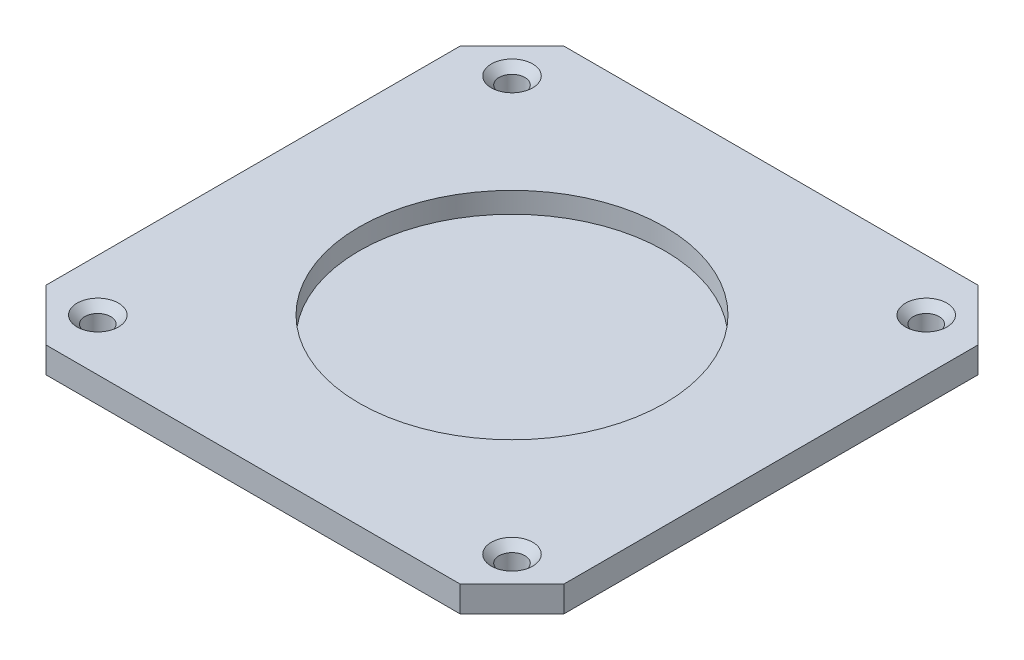
ISO-10303-21;
HEADER;
FILE_DESCRIPTION(('STEP AP214'),'2;1');
FILE_NAME('part.step','',(''),(''),'','','');
FILE_SCHEMA(('AUTOMOTIVE_DESIGN { 1 0 10303 214 1 1 1 1 }'));
ENDSEC;
DATA;
#1=APPLICATION_CONTEXT('core data for automotive mechanical design processes');
#2=APPLICATION_PROTOCOL_DEFINITION('international standard','automotive_design',2000,#1);
#3=PRODUCT_CONTEXT('',#1,'mechanical');
#4=PRODUCT('Part','Part','',(#3));
#5=PRODUCT_RELATED_PRODUCT_CATEGORY('part','',(#4));
#6=PRODUCT_DEFINITION_FORMATION('','',#4);
#7=PRODUCT_DEFINITION_CONTEXT('part definition',#1,'design');
#8=PRODUCT_DEFINITION('design','',#6,#7);
#9=PRODUCT_DEFINITION_SHAPE('','',#8);
#10=(LENGTH_UNIT() NAMED_UNIT(*) SI_UNIT(.MILLI.,.METRE.));
#11=(NAMED_UNIT(*) PLANE_ANGLE_UNIT() SI_UNIT($,.RADIAN.));
#12=(NAMED_UNIT(*) SI_UNIT($,.STERADIAN.) SOLID_ANGLE_UNIT());
#13=UNCERTAINTY_MEASURE_WITH_UNIT(LENGTH_MEASURE(1.E-05),#10,'distance_accuracy_value','');
#14=(GEOMETRIC_REPRESENTATION_CONTEXT(3) GLOBAL_UNCERTAINTY_ASSIGNED_CONTEXT((#13)) GLOBAL_UNIT_ASSIGNED_CONTEXT((#10,
#11,#12)) REPRESENTATION_CONTEXT('',''));
#15=CARTESIAN_POINT('',(0.,0.,0.));
#16=DIRECTION('',(0.,0.,1.));
#17=DIRECTION('',(1.,0.,0.));
#18=AXIS2_PLACEMENT_3D('',#15,#16,#17);
#19=CARTESIAN_POINT('',(0.,-2.5,0.));
#20=DIRECTION('',(0.,-1.,0.));
#21=DIRECTION('',(0.,0.,-1.));
#22=AXIS2_PLACEMENT_3D('',#19,#20,#21);
#23=PLANE('',#22);
#24=CARTESIAN_POINT('',(-40.0000000000004,-2.5,39.9999999999996));
#25=DIRECTION('',(0.,1.,0.));
#26=DIRECTION('',(0.,0.,1.));
#27=AXIS2_PLACEMENT_3D('',#24,#25,#26);
#28=CIRCLE('',#27,2.5);
#29=CARTESIAN_POINT('',(-40.0000000000004,-2.5,42.4999999999996));
#30=VERTEX_POINT('',#29);
#31=EDGE_CURVE('E203',#30,#30,#28,.T.);
#32=ORIENTED_EDGE('',*,*,#31,.T.);
#33=EDGE_LOOP('',(#32));
#34=FACE_BOUND('',#33,.T.);
#35=CARTESIAN_POINT('',(40.,-2.5,40.));
#36=DIRECTION('',(0.,1.,0.));
#37=DIRECTION('',(0.,0.,1.));
#38=AXIS2_PLACEMENT_3D('',#35,#36,#37);
#39=CIRCLE('',#38,2.5);
#40=CARTESIAN_POINT('',(40.,-2.5,42.5));
#41=VERTEX_POINT('',#40);
#42=EDGE_CURVE('E194',#41,#41,#39,.T.);
#43=ORIENTED_EDGE('',*,*,#42,.T.);
#44=EDGE_LOOP('',(#43));
#45=FACE_BOUND('',#44,.T.);
#46=DIRECTION('',(1.,0.,0.));
#47=VECTOR('',#46,1.);
#48=CARTESIAN_POINT('',(-50.,-2.5,50.));
#49=LINE('',#48,#47);
#50=CARTESIAN_POINT('',(-40.,-2.5,50.));
#51=VERTEX_POINT('',#50);
#52=CARTESIAN_POINT('',(40.,-2.5,50.));
#53=VERTEX_POINT('',#52);
#54=EDGE_CURVE('E116',#51,#53,#49,.T.);
#55=ORIENTED_EDGE('',*,*,#54,.F.);
#56=DIRECTION('',(0.707106781186546,0.,0.707106781186549));
#57=VECTOR('',#56,1.);
#58=CARTESIAN_POINT('',(-45.0000000000001,-2.5,44.9999999999999));
#59=LINE('',#58,#57);
#60=CARTESIAN_POINT('',(-50.,-2.5,40.));
#61=VERTEX_POINT('',#60);
#62=EDGE_CURVE('E99',#51,#61,#59,.F.);
#63=ORIENTED_EDGE('',*,*,#62,.T.);
#64=DIRECTION('',(0.,0.,1.));
#65=VECTOR('',#64,1.);
#66=CARTESIAN_POINT('',(-50.,-2.5,50.));
#67=LINE('',#66,#65);
#68=CARTESIAN_POINT('',(-50.,-2.5,-40.));
#69=VERTEX_POINT('',#68);
#70=EDGE_CURVE('E126',#69,#61,#67,.T.);
#71=ORIENTED_EDGE('',*,*,#70,.F.);
#72=DIRECTION('',(-0.707106781186549,0.,0.707106781186546));
#73=VECTOR('',#72,1.);
#74=CARTESIAN_POINT('',(-44.9999999999999,-2.5,-45.0000000000001));
#75=LINE('',#74,#73);
#76=CARTESIAN_POINT('',(-40.,-2.5,-50.));
#77=VERTEX_POINT('',#76);
#78=EDGE_CURVE('E120',#69,#77,#75,.F.);
#79=ORIENTED_EDGE('',*,*,#78,.T.);
#80=DIRECTION('',(-1.,0.,0.));
#81=VECTOR('',#80,1.);
#82=CARTESIAN_POINT('',(-50.,-2.5,-50.));
#83=LINE('',#82,#81);
#84=CARTESIAN_POINT('',(40.,-2.5,-50.));
#85=VERTEX_POINT('',#84);
#86=EDGE_CURVE('E130',#85,#77,#83,.T.);
#87=ORIENTED_EDGE('',*,*,#86,.F.);
#88=DIRECTION('',(-0.707106781186546,0.,-0.707106781186549));
#89=VECTOR('',#88,1.);
#90=CARTESIAN_POINT('',(45.0000000000001,-2.5,-44.9999999999999));
#91=LINE('',#90,#89);
#92=CARTESIAN_POINT('',(50.,-2.5,-40.));
#93=VERTEX_POINT('',#92);
#94=EDGE_CURVE('E136',#85,#93,#91,.F.);
#95=ORIENTED_EDGE('',*,*,#94,.T.);
#96=DIRECTION('',(0.,0.,-1.));
#97=VECTOR('',#96,1.);
#98=CARTESIAN_POINT('',(50.,-2.5,50.));
#99=LINE('',#98,#97);
#100=CARTESIAN_POINT('',(50.,-2.5,40.));
#101=VERTEX_POINT('',#100);
#102=EDGE_CURVE('E158',#101,#93,#99,.T.);
#103=ORIENTED_EDGE('',*,*,#102,.F.);
#104=DIRECTION('',(0.707106781186549,0.,-0.707106781186546));
#105=VECTOR('',#104,1.);
#106=CARTESIAN_POINT('',(44.9999999999999,-2.5,45.0000000000001));
#107=LINE('',#106,#105);
#108=EDGE_CURVE('E110',#101,#53,#107,.F.);
#109=ORIENTED_EDGE('',*,*,#108,.T.);
#110=EDGE_LOOP('',(#55,#63,#71,#79,#87,#95,#103,#109));
#111=FACE_BOUND('',#110,.T.);
#112=CARTESIAN_POINT('',(-40.,-2.5,-40.));
#113=DIRECTION('',(0.,1.,0.));
#114=DIRECTION('',(0.,0.,1.));
#115=AXIS2_PLACEMENT_3D('',#112,#113,#114);
#116=CIRCLE('',#115,2.5);
#117=CARTESIAN_POINT('',(-40.,-2.5,-37.5));
#118=VERTEX_POINT('',#117);
#119=EDGE_CURVE('E163',#118,#118,#116,.T.);
#120=ORIENTED_EDGE('',*,*,#119,.T.);
#121=EDGE_LOOP('',(#120));
#122=FACE_BOUND('',#121,.T.);
#123=CARTESIAN_POINT('',(40.0000000000001,-2.5,-39.9999999999999));
#124=DIRECTION('',(0.,1.,0.));
#125=DIRECTION('',(0.,0.,1.));
#126=AXIS2_PLACEMENT_3D('',#123,#124,#125);
#127=CIRCLE('',#126,2.5);
#128=CARTESIAN_POINT('',(40.0000000000001,-2.5,-37.4999999999999));
#129=VERTEX_POINT('',#128);
#130=EDGE_CURVE('E185',#129,#129,#127,.T.);
#131=ORIENTED_EDGE('',*,*,#130,.T.);
#132=EDGE_LOOP('',(#131));
#133=FACE_BOUND('',#132,.T.);
#134=ADVANCED_FACE('F33',(#34,#45,#111,#122,#133),#23,.T.);
#135=CARTESIAN_POINT('',(50.,2.5,50.));
#136=DIRECTION('',(-1.,0.,0.));
#137=DIRECTION('',(0.,0.,1.));
#138=AXIS2_PLACEMENT_3D('',#135,#136,#137);
#139=PLANE('',#138);
#140=DIRECTION('',(0.,0.,-1.));
#141=VECTOR('',#140,1.);
#142=CARTESIAN_POINT('',(50.,2.5,50.));
#143=LINE('',#142,#141);
#144=CARTESIAN_POINT('',(50.,2.5,40.));
#145=VERTEX_POINT('',#144);
#146=CARTESIAN_POINT('',(50.,2.5,-40.));
#147=VERTEX_POINT('',#146);
#148=EDGE_CURVE('E125',#145,#147,#143,.T.);
#149=ORIENTED_EDGE('',*,*,#148,.F.);
#150=DIRECTION('',(0.,-1.,0.));
#151=VECTOR('',#150,1.);
#152=CARTESIAN_POINT('',(50.,2.5,40.));
#153=LINE('',#152,#151);
#154=EDGE_CURVE('E151',#145,#101,#153,.T.);
#155=ORIENTED_EDGE('',*,*,#154,.T.);
#156=ORIENTED_EDGE('',*,*,#102,.T.);
#157=DIRECTION('',(0.,1.,0.));
#158=VECTOR('',#157,1.);
#159=CARTESIAN_POINT('',(50.,2.5,-40.));
#160=LINE('',#159,#158);
#161=EDGE_CURVE('E149',#93,#147,#160,.T.);
#162=ORIENTED_EDGE('',*,*,#161,.T.);
#163=EDGE_LOOP('',(#149,#155,#156,#162));
#164=FACE_BOUND('',#163,.T.);
#165=ADVANCED_FACE('F157',(#164),#139,.F.);
#166=CARTESIAN_POINT('',(-50.,2.5,-50.));
#167=DIRECTION('',(0.,0.,1.));
#168=DIRECTION('',(1.,0.,0.));
#169=AXIS2_PLACEMENT_3D('',#166,#167,#168);
#170=PLANE('',#169);
#171=DIRECTION('',(-1.,0.,0.));
#172=VECTOR('',#171,1.);
#173=CARTESIAN_POINT('',(-50.,2.5,-50.));
#174=LINE('',#173,#172);
#175=CARTESIAN_POINT('',(40.,2.5,-50.));
#176=VERTEX_POINT('',#175);
#177=CARTESIAN_POINT('',(-40.,2.5,-50.));
#178=VERTEX_POINT('',#177);
#179=EDGE_CURVE('E128',#176,#178,#174,.T.);
#180=ORIENTED_EDGE('',*,*,#179,.F.);
#181=DIRECTION('',(0.,-1.,0.));
#182=VECTOR('',#181,1.);
#183=CARTESIAN_POINT('',(40.,2.5,-50.));
#184=LINE('',#183,#182);
#185=EDGE_CURVE('E11',#176,#85,#184,.T.);
#186=ORIENTED_EDGE('',*,*,#185,.T.);
#187=ORIENTED_EDGE('',*,*,#86,.T.);
#188=DIRECTION('',(0.,1.,0.));
#189=VECTOR('',#188,1.);
#190=CARTESIAN_POINT('',(-40.,2.5,-50.));
#191=LINE('',#190,#189);
#192=EDGE_CURVE('E41',#77,#178,#191,.T.);
#193=ORIENTED_EDGE('',*,*,#192,.T.);
#194=EDGE_LOOP('',(#180,#186,#187,#193));
#195=FACE_BOUND('',#194,.T.);
#196=ADVANCED_FACE('F233',(#195),#170,.F.);
#197=CARTESIAN_POINT('',(-50.,2.5,50.));
#198=DIRECTION('',(1.,0.,0.));
#199=DIRECTION('',(0.,0.,-1.));
#200=AXIS2_PLACEMENT_3D('',#197,#198,#199);
#201=PLANE('',#200);
#202=ORIENTED_EDGE('',*,*,#70,.T.);
#203=DIRECTION('',(0.,1.,0.));
#204=VECTOR('',#203,1.);
#205=CARTESIAN_POINT('',(-50.,2.5,40.));
#206=LINE('',#205,#204);
#207=CARTESIAN_POINT('',(-50.,2.5,40.));
#208=VERTEX_POINT('',#207);
#209=EDGE_CURVE('E104',#61,#208,#206,.T.);
#210=ORIENTED_EDGE('',*,*,#209,.T.);
#211=DIRECTION('',(0.,0.,1.));
#212=VECTOR('',#211,1.);
#213=CARTESIAN_POINT('',(-50.,2.5,50.));
#214=LINE('',#213,#212);
#215=CARTESIAN_POINT('',(-50.,2.5,-40.));
#216=VERTEX_POINT('',#215);
#217=EDGE_CURVE('E170',#216,#208,#214,.T.);
#218=ORIENTED_EDGE('',*,*,#217,.F.);
#219=DIRECTION('',(0.,-1.,0.));
#220=VECTOR('',#219,1.);
#221=CARTESIAN_POINT('',(-50.,2.5,-40.));
#222=LINE('',#221,#220);
#223=EDGE_CURVE('E109',#216,#69,#222,.T.);
#224=ORIENTED_EDGE('',*,*,#223,.T.);
#225=EDGE_LOOP('',(#202,#210,#218,#224));
#226=FACE_BOUND('',#225,.T.);
#227=ADVANCED_FACE('F231',(#226),#201,.F.);
#228=CARTESIAN_POINT('',(-50.,2.5,50.));
#229=DIRECTION('',(0.,0.,-1.));
#230=DIRECTION('',(-1.,0.,0.));
#231=AXIS2_PLACEMENT_3D('',#228,#229,#230);
#232=PLANE('',#231);
#233=DIRECTION('',(1.,0.,0.));
#234=VECTOR('',#233,1.);
#235=CARTESIAN_POINT('',(-50.,2.5,50.));
#236=LINE('',#235,#234);
#237=CARTESIAN_POINT('',(-40.,2.5,50.));
#238=VERTEX_POINT('',#237);
#239=CARTESIAN_POINT('',(40.,2.5,50.));
#240=VERTEX_POINT('',#239);
#241=EDGE_CURVE('E119',#238,#240,#236,.T.);
#242=ORIENTED_EDGE('',*,*,#241,.F.);
#243=DIRECTION('',(0.,-1.,0.));
#244=VECTOR('',#243,1.);
#245=CARTESIAN_POINT('',(-40.,2.5,50.));
#246=LINE('',#245,#244);
#247=EDGE_CURVE('E103',#238,#51,#246,.T.);
#248=ORIENTED_EDGE('',*,*,#247,.T.);
#249=ORIENTED_EDGE('',*,*,#54,.T.);
#250=DIRECTION('',(0.,1.,0.));
#251=VECTOR('',#250,1.);
#252=CARTESIAN_POINT('',(40.,2.5,50.));
#253=LINE('',#252,#251);
#254=EDGE_CURVE('E121',#53,#240,#253,.T.);
#255=ORIENTED_EDGE('',*,*,#254,.T.);
#256=EDGE_LOOP('',(#242,#248,#249,#255));
#257=FACE_BOUND('',#256,.T.);
#258=ADVANCED_FACE('F115',(#257),#232,.F.);
#259=CARTESIAN_POINT('',(0.,2.5,0.));
#260=DIRECTION('',(0.,-1.,0.));
#261=DIRECTION('',(0.,0.,-1.));
#262=AXIS2_PLACEMENT_3D('',#259,#260,#261);
#263=PLANE('',#262);
#264=CARTESIAN_POINT('',(-40.0000000000004,2.5,39.9999999999996));
#265=DIRECTION('',(0.,1.,0.));
#266=DIRECTION('',(0.,0.,1.));
#267=AXIS2_PLACEMENT_3D('',#264,#265,#266);
#268=CIRCLE('',#267,4.);
#269=CARTESIAN_POINT('',(-40.0000000000004,2.5,43.9999999999996));
#270=VERTEX_POINT('',#269);
#271=EDGE_CURVE('E209',#270,#270,#268,.T.);
#272=ORIENTED_EDGE('',*,*,#271,.F.);
#273=EDGE_LOOP('',(#272));
#274=FACE_BOUND('',#273,.T.);
#275=CARTESIAN_POINT('',(40.,2.5,40.));
#276=DIRECTION('',(0.,1.,0.));
#277=DIRECTION('',(0.,0.,1.));
#278=AXIS2_PLACEMENT_3D('',#275,#276,#277);
#279=CIRCLE('',#278,4.);
#280=CARTESIAN_POINT('',(40.,2.5,44.));
#281=VERTEX_POINT('',#280);
#282=EDGE_CURVE('E200',#281,#281,#279,.T.);
#283=ORIENTED_EDGE('',*,*,#282,.F.);
#284=EDGE_LOOP('',(#283));
#285=FACE_BOUND('',#284,.T.);
#286=CARTESIAN_POINT('',(40.0000000000001,2.5,-39.9999999999999));
#287=DIRECTION('',(0.,1.,0.));
#288=DIRECTION('',(0.,0.,1.));
#289=AXIS2_PLACEMENT_3D('',#286,#287,#288);
#290=CIRCLE('',#289,4.);
#291=CARTESIAN_POINT('',(40.0000000000001,2.5,-35.9999999999999));
#292=VERTEX_POINT('',#291);
#293=EDGE_CURVE('E191',#292,#292,#290,.T.);
#294=ORIENTED_EDGE('',*,*,#293,.F.);
#295=EDGE_LOOP('',(#294));
#296=FACE_BOUND('',#295,.T.);
#297=CARTESIAN_POINT('',(0.,2.5,0.));
#298=DIRECTION('',(0.,1.,0.));
#299=DIRECTION('',(0.,0.,1.));
#300=AXIS2_PLACEMENT_3D('',#297,#298,#299);
#301=CIRCLE('',#300,29.5);
#302=CARTESIAN_POINT('',(0.,2.5,29.5));
#303=VERTEX_POINT('',#302);
#304=EDGE_CURVE('E182',#303,#303,#301,.T.);
#305=ORIENTED_EDGE('',*,*,#304,.F.);
#306=EDGE_LOOP('',(#305));
#307=FACE_BOUND('',#306,.T.);
#308=CARTESIAN_POINT('',(-40.,2.5,-40.));
#309=DIRECTION('',(0.,1.,0.));
#310=DIRECTION('',(0.,0.,1.));
#311=AXIS2_PLACEMENT_3D('',#308,#309,#310);
#312=CIRCLE('',#311,4.);
#313=CARTESIAN_POINT('',(-40.,2.5,-36.));
#314=VERTEX_POINT('',#313);
#315=EDGE_CURVE('E176',#314,#314,#312,.T.);
#316=ORIENTED_EDGE('',*,*,#315,.F.);
#317=EDGE_LOOP('',(#316));
#318=FACE_BOUND('',#317,.T.);
#319=ORIENTED_EDGE('',*,*,#217,.T.);
#320=DIRECTION('',(-0.707106781186546,0.,-0.707106781186549));
#321=VECTOR('',#320,1.);
#322=CARTESIAN_POINT('',(-40.,2.5,50.));
#323=LINE('',#322,#321);
#324=EDGE_CURVE('E147',#208,#238,#323,.F.);
#325=ORIENTED_EDGE('',*,*,#324,.T.);
#326=ORIENTED_EDGE('',*,*,#241,.T.);
#327=DIRECTION('',(-0.707106781186549,0.,0.707106781186546));
#328=VECTOR('',#327,1.);
#329=CARTESIAN_POINT('',(50.,2.5,40.));
#330=LINE('',#329,#328);
#331=EDGE_CURVE('E145',#240,#145,#330,.F.);
#332=ORIENTED_EDGE('',*,*,#331,.T.);
#333=ORIENTED_EDGE('',*,*,#148,.T.);
#334=DIRECTION('',(0.707106781186546,0.,0.707106781186549));
#335=VECTOR('',#334,1.);
#336=CARTESIAN_POINT('',(40.,2.5,-50.));
#337=LINE('',#336,#335);
#338=EDGE_CURVE('E54',#147,#176,#337,.F.);
#339=ORIENTED_EDGE('',*,*,#338,.T.);
#340=ORIENTED_EDGE('',*,*,#179,.T.);
#341=DIRECTION('',(0.707106781186549,0.,-0.707106781186546));
#342=VECTOR('',#341,1.);
#343=CARTESIAN_POINT('',(-50.,2.5,-40.));
#344=LINE('',#343,#342);
#345=EDGE_CURVE('E142',#178,#216,#344,.F.);
#346=ORIENTED_EDGE('',*,*,#345,.T.);
#347=EDGE_LOOP('',(#319,#325,#326,#332,#333,#339,#340,#346));
#348=FACE_BOUND('',#347,.T.);
#349=ADVANCED_FACE('F215',(#274,#285,#296,#307,#318,#348),#263,.F.);
#350=CARTESIAN_POINT('',(-40.,2.5,-40.));
#351=DIRECTION('',(0.,1.,0.));
#352=DIRECTION('',(0.,0.,1.));
#353=AXIS2_PLACEMENT_3D('',#350,#351,#352);
#354=CYLINDRICAL_SURFACE('',#353,2.5);
#355=ORIENTED_EDGE('',*,*,#119,.F.);
#356=EDGE_LOOP('',(#355));
#357=FACE_BOUND('',#356,.T.);
#358=CARTESIAN_POINT('',(-40.,0.999999999999995,-40.));
#359=DIRECTION('',(0.,1.,0.));
#360=DIRECTION('',(0.,0.,1.));
#361=AXIS2_PLACEMENT_3D('',#358,#359,#360);
#362=CIRCLE('',#361,2.5);
#363=CARTESIAN_POINT('',(-40.,0.999999999999995,-37.5));
#364=VERTEX_POINT('',#363);
#365=EDGE_CURVE('E166',#364,#364,#362,.T.);
#366=ORIENTED_EDGE('',*,*,#365,.T.);
#367=EDGE_LOOP('',(#366));
#368=FACE_BOUND('',#367,.T.);
#369=ADVANCED_FACE('F218',(#357,#368),#354,.F.);
#370=CARTESIAN_POINT('',(-40.,2.5,-40.));
#371=DIRECTION('',(0.,1.,0.));
#372=DIRECTION('',(0.,0.,1.));
#373=AXIS2_PLACEMENT_3D('',#370,#371,#372);
#374=CONICAL_SURFACE('',#373,4.,0.78539816339745);
#375=ORIENTED_EDGE('',*,*,#365,.F.);
#376=EDGE_LOOP('',(#375));
#377=FACE_BOUND('',#376,.T.);
#378=ORIENTED_EDGE('',*,*,#315,.T.);
#379=EDGE_LOOP('',(#378));
#380=FACE_BOUND('',#379,.T.);
#381=ADVANCED_FACE('F244',(#377,#380),#374,.F.);
#382=CARTESIAN_POINT('',(-40.,2.5,50.));
#383=DIRECTION('',(0.707106781186549,0.,-0.707106781186546));
#384=DIRECTION('',(0.,-1.,0.));
#385=AXIS2_PLACEMENT_3D('',#382,#383,#384);
#386=PLANE('',#385);
#387=ORIENTED_EDGE('',*,*,#324,.F.);
#388=ORIENTED_EDGE('',*,*,#209,.F.);
#389=ORIENTED_EDGE('',*,*,#62,.F.);
#390=ORIENTED_EDGE('',*,*,#247,.F.);
#391=EDGE_LOOP('',(#387,#388,#389,#390));
#392=FACE_BOUND('',#391,.T.);
#393=ADVANCED_FACE('F102',(#392),#386,.F.);
#394=CARTESIAN_POINT('',(50.,2.5,40.));
#395=DIRECTION('',(-0.707106781186546,0.,-0.707106781186549));
#396=DIRECTION('',(0.,-1.,0.));
#397=AXIS2_PLACEMENT_3D('',#394,#395,#396);
#398=PLANE('',#397);
#399=ORIENTED_EDGE('',*,*,#331,.F.);
#400=ORIENTED_EDGE('',*,*,#254,.F.);
#401=ORIENTED_EDGE('',*,*,#108,.F.);
#402=ORIENTED_EDGE('',*,*,#154,.F.);
#403=EDGE_LOOP('',(#399,#400,#401,#402));
#404=FACE_BOUND('',#403,.T.);
#405=ADVANCED_FACE('F237',(#404),#398,.F.);
#406=CARTESIAN_POINT('',(40.,2.5,-50.));
#407=DIRECTION('',(-0.707106781186549,0.,0.707106781186546));
#408=DIRECTION('',(0.,-1.,0.));
#409=AXIS2_PLACEMENT_3D('',#406,#407,#408);
#410=PLANE('',#409);
#411=ORIENTED_EDGE('',*,*,#338,.F.);
#412=ORIENTED_EDGE('',*,*,#161,.F.);
#413=ORIENTED_EDGE('',*,*,#94,.F.);
#414=ORIENTED_EDGE('',*,*,#185,.F.);
#415=EDGE_LOOP('',(#411,#412,#413,#414));
#416=FACE_BOUND('',#415,.T.);
#417=ADVANCED_FACE('F236',(#416),#410,.F.);
#418=CARTESIAN_POINT('',(-50.,2.5,-40.));
#419=DIRECTION('',(0.707106781186546,0.,0.707106781186549));
#420=DIRECTION('',(0.,-1.,0.));
#421=AXIS2_PLACEMENT_3D('',#418,#419,#420);
#422=PLANE('',#421);
#423=ORIENTED_EDGE('',*,*,#345,.F.);
#424=ORIENTED_EDGE('',*,*,#192,.F.);
#425=ORIENTED_EDGE('',*,*,#78,.F.);
#426=ORIENTED_EDGE('',*,*,#223,.F.);
#427=EDGE_LOOP('',(#423,#424,#425,#426));
#428=FACE_BOUND('',#427,.T.);
#429=ADVANCED_FACE('F35',(#428),#422,.F.);
#430=CARTESIAN_POINT('',(0.,-1.5,0.));
#431=DIRECTION('',(0.,-1.,0.));
#432=DIRECTION('',(0.,0.,-1.));
#433=AXIS2_PLACEMENT_3D('',#430,#431,#432);
#434=PLANE('',#433);
#435=CARTESIAN_POINT('',(0.,-1.5,0.));
#436=DIRECTION('',(0.,1.,0.));
#437=DIRECTION('',(0.,0.,1.));
#438=AXIS2_PLACEMENT_3D('',#435,#436,#437);
#439=CIRCLE('',#438,29.5);
#440=CARTESIAN_POINT('',(0.,-1.5,29.5));
#441=VERTEX_POINT('',#440);
#442=EDGE_CURVE('E179',#441,#441,#439,.T.);
#443=ORIENTED_EDGE('',*,*,#442,.T.);
#444=EDGE_LOOP('',(#443));
#445=FACE_BOUND('',#444,.T.);
#446=ADVANCED_FACE('F314',(#445),#434,.F.);
#447=CARTESIAN_POINT('',(0.,2.5,0.));
#448=DIRECTION('',(0.,1.,0.));
#449=DIRECTION('',(0.,0.,1.));
#450=AXIS2_PLACEMENT_3D('',#447,#448,#449);
#451=CYLINDRICAL_SURFACE('',#450,29.5);
#452=ORIENTED_EDGE('',*,*,#442,.F.);
#453=EDGE_LOOP('',(#452));
#454=FACE_BOUND('',#453,.T.);
#455=ORIENTED_EDGE('',*,*,#304,.T.);
#456=EDGE_LOOP('',(#455));
#457=FACE_BOUND('',#456,.T.);
#458=ADVANCED_FACE('F322',(#454,#457),#451,.F.);
#459=CARTESIAN_POINT('',(40.0000000000001,2.5,-39.9999999999999));
#460=DIRECTION('',(0.,1.,0.));
#461=DIRECTION('',(0.,0.,1.));
#462=AXIS2_PLACEMENT_3D('',#459,#460,#461);
#463=CYLINDRICAL_SURFACE('',#462,2.5);
#464=ORIENTED_EDGE('',*,*,#130,.F.);
#465=EDGE_LOOP('',(#464));
#466=FACE_BOUND('',#465,.T.);
#467=CARTESIAN_POINT('',(40.0000000000001,0.999999999999995,-39.9999999999999));
#468=DIRECTION('',(0.,1.,0.));
#469=DIRECTION('',(0.,0.,1.));
#470=AXIS2_PLACEMENT_3D('',#467,#468,#469);
#471=CIRCLE('',#470,2.5);
#472=CARTESIAN_POINT('',(40.0000000000001,0.999999999999995,-37.4999999999999));
#473=VERTEX_POINT('',#472);
#474=EDGE_CURVE('E188',#473,#473,#471,.T.);
#475=ORIENTED_EDGE('',*,*,#474,.T.);
#476=EDGE_LOOP('',(#475));
#477=FACE_BOUND('',#476,.T.);
#478=ADVANCED_FACE('F331',(#466,#477),#463,.F.);
#479=CARTESIAN_POINT('',(40.0000000000001,2.5,-39.9999999999999));
#480=DIRECTION('',(0.,1.,0.));
#481=DIRECTION('',(0.,0.,1.));
#482=AXIS2_PLACEMENT_3D('',#479,#480,#481);
#483=CONICAL_SURFACE('',#482,4.,0.785398163397447);
#484=ORIENTED_EDGE('',*,*,#474,.F.);
#485=EDGE_LOOP('',(#484));
#486=FACE_BOUND('',#485,.T.);
#487=ORIENTED_EDGE('',*,*,#293,.T.);
#488=EDGE_LOOP('',(#487));
#489=FACE_BOUND('',#488,.T.);
#490=ADVANCED_FACE('F346',(#486,#489),#483,.F.);
#491=CARTESIAN_POINT('',(40.,2.5,40.));
#492=DIRECTION('',(0.,1.,0.));
#493=DIRECTION('',(0.,0.,1.));
#494=AXIS2_PLACEMENT_3D('',#491,#492,#493);
#495=CYLINDRICAL_SURFACE('',#494,2.5);
#496=ORIENTED_EDGE('',*,*,#42,.F.);
#497=EDGE_LOOP('',(#496));
#498=FACE_BOUND('',#497,.T.);
#499=CARTESIAN_POINT('',(40.,0.999999999999995,40.));
#500=DIRECTION('',(0.,1.,0.));
#501=DIRECTION('',(0.,0.,1.));
#502=AXIS2_PLACEMENT_3D('',#499,#500,#501);
#503=CIRCLE('',#502,2.5);
#504=CARTESIAN_POINT('',(40.,0.999999999999995,42.5));
#505=VERTEX_POINT('',#504);
#506=EDGE_CURVE('E197',#505,#505,#503,.T.);
#507=ORIENTED_EDGE('',*,*,#506,.T.);
#508=EDGE_LOOP('',(#507));
#509=FACE_BOUND('',#508,.T.);
#510=ADVANCED_FACE('F355',(#498,#509),#495,.F.);
#511=CARTESIAN_POINT('',(40.,2.5,40.));
#512=DIRECTION('',(0.,1.,0.));
#513=DIRECTION('',(0.,0.,1.));
#514=AXIS2_PLACEMENT_3D('',#511,#512,#513);
#515=CONICAL_SURFACE('',#514,4.,0.78539816339745);
#516=ORIENTED_EDGE('',*,*,#506,.F.);
#517=EDGE_LOOP('',(#516));
#518=FACE_BOUND('',#517,.T.);
#519=ORIENTED_EDGE('',*,*,#282,.T.);
#520=EDGE_LOOP('',(#519));
#521=FACE_BOUND('',#520,.T.);
#522=ADVANCED_FACE('F364',(#518,#521),#515,.F.);
#523=CARTESIAN_POINT('',(-40.0000000000004,2.5,39.9999999999996));
#524=DIRECTION('',(0.,1.,0.));
#525=DIRECTION('',(0.,0.,1.));
#526=AXIS2_PLACEMENT_3D('',#523,#524,#525);
#527=CYLINDRICAL_SURFACE('',#526,2.5);
#528=ORIENTED_EDGE('',*,*,#31,.F.);
#529=EDGE_LOOP('',(#528));
#530=FACE_BOUND('',#529,.T.);
#531=CARTESIAN_POINT('',(-40.0000000000004,0.999999999999995,39.9999999999996));
#532=DIRECTION('',(0.,1.,0.));
#533=DIRECTION('',(0.,0.,1.));
#534=AXIS2_PLACEMENT_3D('',#531,#532,#533);
#535=CIRCLE('',#534,2.5);
#536=CARTESIAN_POINT('',(-40.0000000000004,0.999999999999995,42.4999999999996));
#537=VERTEX_POINT('',#536);
#538=EDGE_CURVE('E206',#537,#537,#535,.T.);
#539=ORIENTED_EDGE('',*,*,#538,.T.);
#540=EDGE_LOOP('',(#539));
#541=FACE_BOUND('',#540,.T.);
#542=ADVANCED_FACE('F373',(#530,#541),#527,.F.);
#543=CARTESIAN_POINT('',(-40.0000000000004,2.5,39.9999999999996));
#544=DIRECTION('',(0.,1.,0.));
#545=DIRECTION('',(0.,0.,1.));
#546=AXIS2_PLACEMENT_3D('',#543,#544,#545);
#547=CONICAL_SURFACE('',#546,4.,0.785398163397447);
#548=ORIENTED_EDGE('',*,*,#538,.F.);
#549=EDGE_LOOP('',(#548));
#550=FACE_BOUND('',#549,.T.);
#551=ORIENTED_EDGE('',*,*,#271,.T.);
#552=EDGE_LOOP('',(#551));
#553=FACE_BOUND('',#552,.T.);
#554=ADVANCED_FACE('F213',(#550,#553),#547,.F.);
#555=CLOSED_SHELL('',(#134,#165,#196,#227,#258,#349,#369,#381,#393,#405,#417,#429,#446,#458,
#478,#490,#510,#522,#542,#554));
#556=MANIFOLD_SOLID_BREP('B2',#555);
#557=ADVANCED_BREP_SHAPE_REPRESENTATION('',(#18,#556),#14);
#558=SHAPE_DEFINITION_REPRESENTATION(#9,#557);
ENDSEC;
END-ISO-10303-21;
